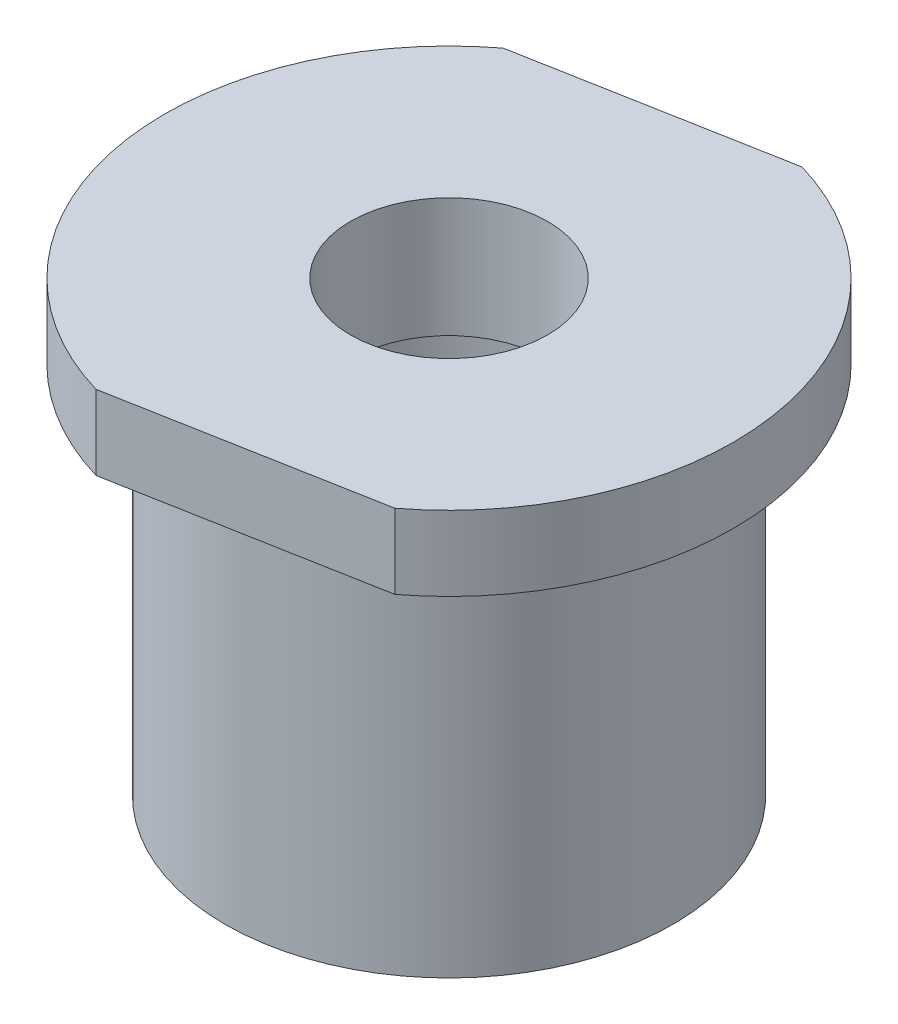
ISO-10303-21;
HEADER;
FILE_DESCRIPTION(('STEP AP214'),'2;1');
FILE_NAME('part.step','',(''),(''),'','','');
FILE_SCHEMA(('AUTOMOTIVE_DESIGN { 1 0 10303 214 1 1 1 1 }'));
ENDSEC;
DATA;
#1=APPLICATION_CONTEXT('core data for automotive mechanical design processes');
#2=APPLICATION_PROTOCOL_DEFINITION('international standard','automotive_design',2000,#1);
#3=PRODUCT_CONTEXT('',#1,'mechanical');
#4=PRODUCT('Part','Part','',(#3));
#5=PRODUCT_RELATED_PRODUCT_CATEGORY('part','',(#4));
#6=PRODUCT_DEFINITION_FORMATION('','',#4);
#7=PRODUCT_DEFINITION_CONTEXT('part definition',#1,'design');
#8=PRODUCT_DEFINITION('design','',#6,#7);
#9=PRODUCT_DEFINITION_SHAPE('','',#8);
#10=(LENGTH_UNIT() NAMED_UNIT(*) SI_UNIT(.MILLI.,.METRE.));
#11=(NAMED_UNIT(*) PLANE_ANGLE_UNIT() SI_UNIT($,.RADIAN.));
#12=(NAMED_UNIT(*) SI_UNIT($,.STERADIAN.) SOLID_ANGLE_UNIT());
#13=UNCERTAINTY_MEASURE_WITH_UNIT(LENGTH_MEASURE(1.E-05),#10,'distance_accuracy_value','');
#14=(GEOMETRIC_REPRESENTATION_CONTEXT(3) GLOBAL_UNCERTAINTY_ASSIGNED_CONTEXT((#13)) GLOBAL_UNIT_ASSIGNED_CONTEXT((#10,
#11,#12)) REPRESENTATION_CONTEXT('',''));
#15=CARTESIAN_POINT('',(0.,0.,0.));
#16=DIRECTION('',(0.,0.,1.));
#17=DIRECTION('',(1.,0.,0.));
#18=AXIS2_PLACEMENT_3D('',#15,#16,#17);
#19=CARTESIAN_POINT('',(0.,7.5,0.));
#20=DIRECTION('',(0.,1.,0.));
#21=DIRECTION('',(0.,0.,1.));
#22=AXIS2_PLACEMENT_3D('',#19,#20,#21);
#23=CYLINDRICAL_SURFACE('',#22,9.525);
#24=DIRECTION('',(0.,1.,0.));
#25=VECTOR('',#24,1.);
#26=CARTESIAN_POINT('',(-2.68680712774619,-7.5,9.13819962893634));
#27=LINE('',#26,#25);
#28=CARTESIAN_POINT('',(-2.68680712774618,5.,9.13819962893634));
#29=VERTEX_POINT('',#28);
#30=CARTESIAN_POINT('',(-2.68680712774619,7.5,9.13819962893634));
#31=VERTEX_POINT('',#30);
#32=EDGE_CURVE('E46',#29,#31,#27,.T.);
#33=ORIENTED_EDGE('',*,*,#32,.T.);
#34=CARTESIAN_POINT('',(0.,7.5,0.));
#35=DIRECTION('',(0.,1.,0.));
#36=DIRECTION('',(0.,0.,1.));
#37=AXIS2_PLACEMENT_3D('',#34,#35,#36);
#38=CIRCLE('',#37,9.525);
#39=CARTESIAN_POINT('',(-5.76751386422492,7.5,-7.58033039029126));
#40=VERTEX_POINT('',#39);
#41=EDGE_CURVE('E84',#40,#31,#38,.T.);
#42=ORIENTED_EDGE('',*,*,#41,.F.);
#43=DIRECTION('',(0.,1.,0.));
#44=VECTOR('',#43,1.);
#45=CARTESIAN_POINT('',(-5.76751386422492,-7.5,-7.58033039029126));
#46=LINE('',#45,#44);
#47=CARTESIAN_POINT('',(-5.76751386422492,5.,-7.58033039029126));
#48=VERTEX_POINT('',#47);
#49=EDGE_CURVE('E102',#48,#40,#46,.T.);
#50=ORIENTED_EDGE('',*,*,#49,.F.);
#51=CARTESIAN_POINT('',(0.,5.,0.));
#52=DIRECTION('',(0.,1.,0.));
#53=DIRECTION('',(0.,0.,1.));
#54=AXIS2_PLACEMENT_3D('',#51,#52,#53);
#55=CIRCLE('',#54,9.525);
#56=EDGE_CURVE('E88',#48,#29,#55,.T.);
#57=ORIENTED_EDGE('',*,*,#56,.T.);
#58=EDGE_LOOP('',(#33,#42,#50,#57));
#59=FACE_BOUND('',#58,.T.);
#60=ADVANCED_FACE('F32',(#59),#23,.T.);
#61=CARTESIAN_POINT('',(0.,-7.5,0.));
#62=DIRECTION('',(0.,1.,0.));
#63=DIRECTION('',(0.,0.,1.));
#64=AXIS2_PLACEMENT_3D('',#61,#62,#63);
#65=CYLINDRICAL_SURFACE('',#64,3.3);
#66=CARTESIAN_POINT('',(0.,7.5,0.));
#67=DIRECTION('',(0.,1.,0.));
#68=DIRECTION('',(0.,0.,1.));
#69=AXIS2_PLACEMENT_3D('',#66,#67,#68);
#70=CIRCLE('',#69,3.3);
#71=CARTESIAN_POINT('',(0.,7.5,3.3));
#72=VERTEX_POINT('',#71);
#73=EDGE_CURVE('E96',#72,#72,#70,.T.);
#74=ORIENTED_EDGE('',*,*,#73,.T.);
#75=EDGE_LOOP('',(#74));
#76=FACE_BOUND('',#75,.T.);
#77=CARTESIAN_POINT('',(0.,3.5,0.));
#78=DIRECTION('',(0.,-1.,0.));
#79=DIRECTION('',(0.,0.,-1.));
#80=AXIS2_PLACEMENT_3D('',#77,#78,#79);
#81=CIRCLE('',#80,3.3);
#82=CARTESIAN_POINT('',(0.,3.5,-3.3));
#83=VERTEX_POINT('',#82);
#84=EDGE_CURVE('E94',#83,#83,#81,.F.);
#85=ORIENTED_EDGE('',*,*,#84,.F.);
#86=EDGE_LOOP('',(#85));
#87=FACE_BOUND('',#86,.T.);
#88=ADVANCED_FACE('F152',(#76,#87),#65,.F.);
#89=CARTESIAN_POINT('',(0.,7.5,0.));
#90=DIRECTION('',(0.,1.,0.));
#91=DIRECTION('',(0.,0.,1.));
#92=AXIS2_PLACEMENT_3D('',#89,#90,#91);
#93=PLANE('',#92);
#94=DIRECTION('',(-0.983442942307506,0.,0.181218043322279));
#95=VECTOR('',#94,1.);
#96=CARTESIAN_POINT('',(5.76751386422493,7.5,7.58033039029126));
#97=LINE('',#96,#95);
#98=CARTESIAN_POINT('',(5.76751386422493,7.5,7.58033039029126));
#99=VERTEX_POINT('',#98);
#100=EDGE_CURVE('E74',#99,#31,#97,.T.);
#101=ORIENTED_EDGE('',*,*,#100,.F.);
#102=CARTESIAN_POINT('',(2.6868071277462,7.5,-9.13819962893634));
#103=VERTEX_POINT('',#102);
#104=EDGE_CURVE('E81',#99,#103,#38,.T.);
#105=ORIENTED_EDGE('',*,*,#104,.T.);
#106=DIRECTION('',(0.983442942307506,0.,-0.181218043322279));
#107=VECTOR('',#106,1.);
#108=CARTESIAN_POINT('',(2.6868071277462,7.5,-9.13819962893634));
#109=LINE('',#108,#107);
#110=EDGE_CURVE('E106',#40,#103,#109,.T.);
#111=ORIENTED_EDGE('',*,*,#110,.F.);
#112=ORIENTED_EDGE('',*,*,#41,.T.);
#113=EDGE_LOOP('',(#101,#105,#111,#112));
#114=FACE_BOUND('',#113,.T.);
#115=ORIENTED_EDGE('',*,*,#73,.F.);
#116=EDGE_LOOP('',(#115));
#117=FACE_BOUND('',#116,.T.);
#118=ADVANCED_FACE('F34',(#114,#117),#93,.T.);
#119=DIRECTION('',(0.,1.,0.));
#120=VECTOR('',#119,1.);
#121=CARTESIAN_POINT('',(5.76751386422493,-7.5,7.58033039029126));
#122=LINE('',#121,#120);
#123=CARTESIAN_POINT('',(5.76751386422493,5.,7.58033039029126));
#124=VERTEX_POINT('',#123);
#125=EDGE_CURVE('E71',#124,#99,#122,.T.);
#126=ORIENTED_EDGE('',*,*,#125,.F.);
#127=CARTESIAN_POINT('',(2.6868071277462,5.,-9.13819962893634));
#128=VERTEX_POINT('',#127);
#129=EDGE_CURVE('E54',#124,#128,#55,.T.);
#130=ORIENTED_EDGE('',*,*,#129,.T.);
#131=DIRECTION('',(0.,1.,0.));
#132=VECTOR('',#131,1.);
#133=CARTESIAN_POINT('',(2.6868071277462,-7.5,-9.13819962893634));
#134=LINE('',#133,#132);
#135=EDGE_CURVE('E87',#128,#103,#134,.T.);
#136=ORIENTED_EDGE('',*,*,#135,.T.);
#137=ORIENTED_EDGE('',*,*,#104,.F.);
#138=EDGE_LOOP('',(#126,#130,#136,#137));
#139=FACE_BOUND('',#138,.T.);
#140=ADVANCED_FACE('F86',(#139),#23,.T.);
#141=CARTESIAN_POINT('',(-9.525,5.,0.));
#142=DIRECTION('',(0.,-1.,0.));
#143=DIRECTION('',(0.,0.,-1.));
#144=AXIS2_PLACEMENT_3D('',#141,#142,#143);
#145=PLANE('',#144);
#146=DIRECTION('',(0.983442942307506,0.,-0.181218043322279));
#147=VECTOR('',#146,1.);
#148=CARTESIAN_POINT('',(-7.67184582963721,5.,10.0567877041356));
#149=LINE('',#148,#147);
#150=EDGE_CURVE('E11',#29,#124,#149,.T.);
#151=ORIENTED_EDGE('',*,*,#150,.F.);
#152=ORIENTED_EDGE('',*,*,#56,.F.);
#153=DIRECTION('',(-0.983442942307506,0.,0.181218043322279));
#154=VECTOR('',#153,1.);
#155=CARTESIAN_POINT('',(-10.752552566116,5.,-6.66174231509203));
#156=LINE('',#155,#154);
#157=EDGE_CURVE('E40',#128,#48,#156,.T.);
#158=ORIENTED_EDGE('',*,*,#157,.F.);
#159=ORIENTED_EDGE('',*,*,#129,.F.);
#160=EDGE_LOOP('',(#151,#152,#158,#159));
#161=FACE_BOUND('',#160,.T.);
#162=CARTESIAN_POINT('',(0.,5.,0.));
#163=DIRECTION('',(0.,1.,0.));
#164=DIRECTION('',(0.,0.,1.));
#165=AXIS2_PLACEMENT_3D('',#162,#163,#164);
#166=CIRCLE('',#165,7.5);
#167=CARTESIAN_POINT('',(0.,5.,7.5));
#168=VERTEX_POINT('',#167);
#169=EDGE_CURVE('E110',#168,#168,#166,.T.);
#170=ORIENTED_EDGE('',*,*,#169,.T.);
#171=EDGE_LOOP('',(#170));
#172=FACE_BOUND('',#171,.T.);
#173=ADVANCED_FACE('F108',(#161,#172),#145,.T.);
#174=CARTESIAN_POINT('',(0.,7.5,0.));
#175=DIRECTION('',(0.,1.,0.));
#176=DIRECTION('',(0.,0.,1.));
#177=AXIS2_PLACEMENT_3D('',#174,#175,#176);
#178=CYLINDRICAL_SURFACE('',#177,7.5);
#179=CARTESIAN_POINT('',(0.,-7.5,0.));
#180=DIRECTION('',(0.,1.,0.));
#181=DIRECTION('',(0.,0.,1.));
#182=AXIS2_PLACEMENT_3D('',#179,#180,#181);
#183=CIRCLE('',#182,7.5);
#184=CARTESIAN_POINT('',(0.,-7.5,7.5));
#185=VERTEX_POINT('',#184);
#186=EDGE_CURVE('E112',#185,#185,#183,.T.);
#187=ORIENTED_EDGE('',*,*,#186,.T.);
#188=EDGE_LOOP('',(#187));
#189=FACE_BOUND('',#188,.T.);
#190=ORIENTED_EDGE('',*,*,#169,.F.);
#191=EDGE_LOOP('',(#190));
#192=FACE_BOUND('',#191,.T.);
#193=ADVANCED_FACE('F140',(#189,#192),#178,.T.);
#194=CARTESIAN_POINT('',(-7.5,-7.5,0.));
#195=DIRECTION('',(0.,-1.,0.));
#196=DIRECTION('',(0.,0.,-1.));
#197=AXIS2_PLACEMENT_3D('',#194,#195,#196);
#198=PLANE('',#197);
#199=CARTESIAN_POINT('',(0.,-7.5,0.));
#200=DIRECTION('',(0.,-1.,0.));
#201=DIRECTION('',(0.,0.,-1.));
#202=AXIS2_PLACEMENT_3D('',#199,#200,#201);
#203=CIRCLE('',#202,5.);
#204=CARTESIAN_POINT('',(0.,-7.5,-5.));
#205=VERTEX_POINT('',#204);
#206=EDGE_CURVE('E119',#205,#205,#203,.T.);
#207=ORIENTED_EDGE('',*,*,#206,.F.);
#208=EDGE_LOOP('',(#207));
#209=FACE_BOUND('',#208,.T.);
#210=ORIENTED_EDGE('',*,*,#186,.F.);
#211=EDGE_LOOP('',(#210));
#212=FACE_BOUND('',#211,.T.);
#213=ADVANCED_FACE('F137',(#209,#212),#198,.T.);
#214=CARTESIAN_POINT('',(0.,3.5,0.));
#215=DIRECTION('',(0.,-1.,0.));
#216=DIRECTION('',(0.,0.,-1.));
#217=AXIS2_PLACEMENT_3D('',#214,#215,#216);
#218=PLANE('',#217);
#219=CARTESIAN_POINT('',(0.,3.5,0.));
#220=DIRECTION('',(0.,-1.,0.));
#221=DIRECTION('',(0.,0.,-1.));
#222=AXIS2_PLACEMENT_3D('',#219,#220,#221);
#223=CIRCLE('',#222,5.);
#224=CARTESIAN_POINT('',(0.,3.5,-5.));
#225=VERTEX_POINT('',#224);
#226=EDGE_CURVE('E97',#225,#225,#223,.T.);
#227=ORIENTED_EDGE('',*,*,#226,.T.);
#228=EDGE_LOOP('',(#227));
#229=FACE_BOUND('',#228,.T.);
#230=ORIENTED_EDGE('',*,*,#84,.T.);
#231=EDGE_LOOP('',(#230));
#232=FACE_BOUND('',#231,.T.);
#233=ADVANCED_FACE('F128',(#229,#232),#218,.T.);
#234=CARTESIAN_POINT('',(0.,3.5,0.));
#235=DIRECTION('',(0.,-1.,0.));
#236=DIRECTION('',(0.,0.,-1.));
#237=AXIS2_PLACEMENT_3D('',#234,#235,#236);
#238=CYLINDRICAL_SURFACE('',#237,5.);
#239=ORIENTED_EDGE('',*,*,#226,.F.);
#240=EDGE_LOOP('',(#239));
#241=FACE_BOUND('',#240,.T.);
#242=ORIENTED_EDGE('',*,*,#206,.T.);
#243=EDGE_LOOP('',(#242));
#244=FACE_BOUND('',#243,.T.);
#245=ADVANCED_FACE('F131',(#241,#244),#238,.F.);
#246=CARTESIAN_POINT('',(2.6868071277462,-7.5,-9.13819962893634));
#247=DIRECTION('',(0.181218043322279,0.,0.983442942307506));
#248=DIRECTION('',(0.983442942307506,0.,-0.181218043322279));
#249=AXIS2_PLACEMENT_3D('',#246,#247,#248);
#250=PLANE('',#249);
#251=ORIENTED_EDGE('',*,*,#157,.T.);
#252=ORIENTED_EDGE('',*,*,#49,.T.);
#253=ORIENTED_EDGE('',*,*,#110,.T.);
#254=ORIENTED_EDGE('',*,*,#135,.F.);
#255=EDGE_LOOP('',(#251,#252,#253,#254));
#256=FACE_BOUND('',#255,.T.);
#257=ADVANCED_FACE('F101',(#256),#250,.F.);
#258=CARTESIAN_POINT('',(5.76751386422493,-7.5,7.58033039029126));
#259=DIRECTION('',(-0.181218043322279,0.,-0.983442942307506));
#260=DIRECTION('',(-0.983442942307506,0.,0.181218043322279));
#261=AXIS2_PLACEMENT_3D('',#258,#259,#260);
#262=PLANE('',#261);
#263=ORIENTED_EDGE('',*,*,#150,.T.);
#264=ORIENTED_EDGE('',*,*,#125,.T.);
#265=ORIENTED_EDGE('',*,*,#100,.T.);
#266=ORIENTED_EDGE('',*,*,#32,.F.);
#267=EDGE_LOOP('',(#263,#264,#265,#266));
#268=FACE_BOUND('',#267,.T.);
#269=ADVANCED_FACE('F73',(#268),#262,.F.);
#270=CLOSED_SHELL('',(#60,#88,#118,#140,#173,#193,#213,#233,#245,#257,#269));
#271=MANIFOLD_SOLID_BREP('B2',#270);
#272=ADVANCED_BREP_SHAPE_REPRESENTATION('',(#18,#271),#14);
#273=SHAPE_DEFINITION_REPRESENTATION(#9,#272);
ENDSEC;
END-ISO-10303-21;
